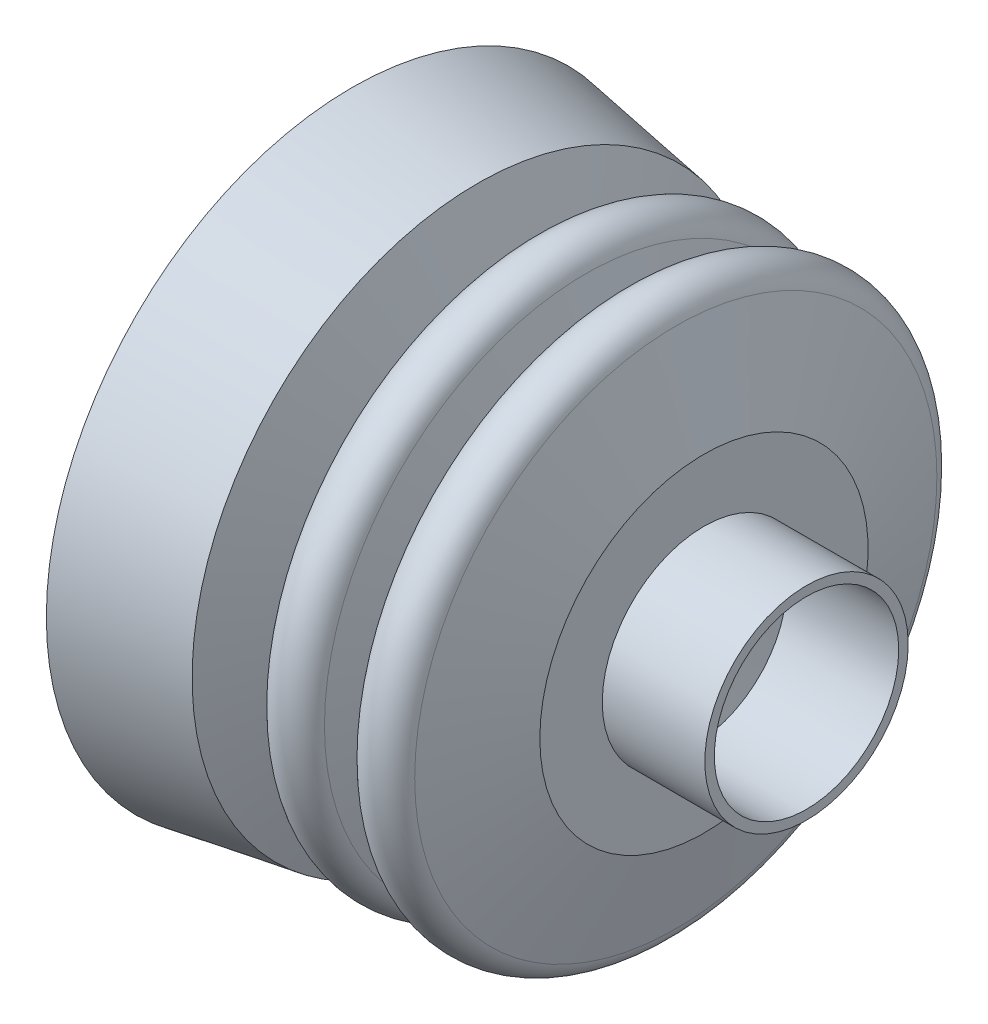
ISO-10303-21;
HEADER;
FILE_DESCRIPTION(('STEP AP214'),'2;1');
FILE_NAME('part.step','',(''),(''),'','','');
FILE_SCHEMA(('AUTOMOTIVE_DESIGN { 1 0 10303 214 1 1 1 1 }'));
ENDSEC;
DATA;
#1=APPLICATION_CONTEXT('core data for automotive mechanical design processes');
#2=APPLICATION_PROTOCOL_DEFINITION('international standard','automotive_design',2000,#1);
#3=PRODUCT_CONTEXT('',#1,'mechanical');
#4=PRODUCT('Part','Part','',(#3));
#5=PRODUCT_RELATED_PRODUCT_CATEGORY('part','',(#4));
#6=PRODUCT_DEFINITION_FORMATION('','',#4);
#7=PRODUCT_DEFINITION_CONTEXT('part definition',#1,'design');
#8=PRODUCT_DEFINITION('design','',#6,#7);
#9=PRODUCT_DEFINITION_SHAPE('','',#8);
#10=(LENGTH_UNIT() NAMED_UNIT(*) SI_UNIT(.MILLI.,.METRE.));
#11=(NAMED_UNIT(*) PLANE_ANGLE_UNIT() SI_UNIT($,.RADIAN.));
#12=(NAMED_UNIT(*) SI_UNIT($,.STERADIAN.) SOLID_ANGLE_UNIT());
#13=UNCERTAINTY_MEASURE_WITH_UNIT(LENGTH_MEASURE(1.E-05),#10,'distance_accuracy_value','');
#14=(GEOMETRIC_REPRESENTATION_CONTEXT(3) GLOBAL_UNCERTAINTY_ASSIGNED_CONTEXT((#13)) GLOBAL_UNIT_ASSIGNED_CONTEXT((#10,
#11,#12)) REPRESENTATION_CONTEXT('',''));
#15=CARTESIAN_POINT('',(0.,0.,0.));
#16=DIRECTION('',(0.,0.,1.));
#17=DIRECTION('',(1.,0.,0.));
#18=AXIS2_PLACEMENT_3D('',#15,#16,#17);
#19=CARTESIAN_POINT('',(24.3215823291821,19.084269403054,0.));
#20=DIRECTION('',(-1.,0.,0.));
#21=DIRECTION('',(0.,0.,1.));
#22=AXIS2_PLACEMENT_3D('',#19,#20,#21);
#23=PLANE('',#22);
#24=CARTESIAN_POINT('',(24.3215823291821,19.084269403054,0.));
#25=DIRECTION('',(1.,0.,0.));
#26=DIRECTION('',(0.,0.,-1.));
#27=AXIS2_PLACEMENT_3D('',#24,#25,#26);
#28=CIRCLE('',#27,4.85271424064872);
#29=CARTESIAN_POINT('',(24.3215823291821,19.084269403054,-4.85271424064872));
#30=VERTEX_POINT('',#29);
#31=EDGE_CURVE('E87',#30,#30,#28,.T.);
#32=ORIENTED_EDGE('',*,*,#31,.F.);
#33=EDGE_LOOP('',(#32));
#34=FACE_BOUND('',#33,.T.);
#35=CARTESIAN_POINT('',(24.3215823291821,19.084269403054,0.));
#36=DIRECTION('',(1.,0.,0.));
#37=DIRECTION('',(0.,0.,-1.));
#38=AXIS2_PLACEMENT_3D('',#35,#36,#37);
#39=CIRCLE('',#38,5.35271424064872);
#40=CARTESIAN_POINT('',(24.3215823291821,19.084269403054,-5.35271424064872));
#41=VERTEX_POINT('',#40);
#42=EDGE_CURVE('E42',#41,#41,#39,.T.);
#43=ORIENTED_EDGE('',*,*,#42,.T.);
#44=EDGE_LOOP('',(#43));
#45=FACE_BOUND('',#44,.T.);
#46=ADVANCED_FACE('F39',(#34,#45),#23,.F.);
#47=CARTESIAN_POINT('',(0.329027714864767,19.084269403054,0.));
#48=DIRECTION('',(1.,0.,0.));
#49=DIRECTION('',(0.,0.,-1.));
#50=AXIS2_PLACEMENT_3D('',#47,#48,#49);
#51=CONICAL_SURFACE('',#50,15.6,1.40916007688253);
#52=CARTESIAN_POINT('',(0.329027714864767,19.084269403054,0.));
#53=DIRECTION('',(1.,0.,0.));
#54=DIRECTION('',(0.,0.,-1.));
#55=AXIS2_PLACEMENT_3D('',#52,#53,#54);
#56=CIRCLE('',#55,15.6);
#57=CARTESIAN_POINT('',(0.329027714864767,19.084269403054,-15.6));
#58=VERTEX_POINT('',#57);
#59=EDGE_CURVE('E10',#58,#58,#56,.T.);
#60=ORIENTED_EDGE('',*,*,#59,.T.);
#61=EDGE_LOOP('',(#60));
#62=FACE_BOUND('',#61,.T.);
#63=CARTESIAN_POINT('',(0.409494386453263,19.084269403054,0.));
#64=DIRECTION('',(-1.,0.,0.));
#65=DIRECTION('',(0.,0.,1.));
#66=AXIS2_PLACEMENT_3D('',#63,#64,#65);
#67=CIRCLE('',#66,16.093482638766);
#68=CARTESIAN_POINT('',(0.409494386453263,19.084269403054,16.093482638766));
#69=VERTEX_POINT('',#68);
#70=EDGE_CURVE('E58',#69,#69,#67,.F.);
#71=ORIENTED_EDGE('',*,*,#70,.F.);
#72=EDGE_LOOP('',(#71));
#73=FACE_BOUND('',#72,.T.);
#74=ADVANCED_FACE('F132',(#62,#73),#51,.T.);
#75=CARTESIAN_POINT('',(0.329027714864767,19.084269403054,0.));
#76=DIRECTION('',(-1.,0.,0.));
#77=DIRECTION('',(0.,0.,1.));
#78=AXIS2_PLACEMENT_3D('',#75,#76,#77);
#79=CONICAL_SURFACE('',#78,15.6,0.16163624991237);
#80=CARTESIAN_POINT('',(6.64004677874887,19.084269403054,0.));
#81=DIRECTION('',(1.,0.,0.));
#82=DIRECTION('',(0.,0.,-1.));
#83=AXIS2_PLACEMENT_3D('',#80,#81,#82);
#84=CIRCLE('',#83,14.5709330004554);
#85=CARTESIAN_POINT('',(6.64004677874887,19.084269403054,-14.5709330004554));
#86=VERTEX_POINT('',#85);
#87=EDGE_CURVE('E46',#86,#86,#84,.T.);
#88=ORIENTED_EDGE('',*,*,#87,.T.);
#89=EDGE_LOOP('',(#88));
#90=FACE_BOUND('',#89,.T.);
#91=ORIENTED_EDGE('',*,*,#59,.F.);
#92=EDGE_LOOP('',(#91));
#93=FACE_BOUND('',#92,.T.);
#94=ADVANCED_FACE('F129',(#90,#93),#79,.F.);
#95=CARTESIAN_POINT('',(6.64004677874887,19.084269403054,0.));
#96=DIRECTION('',(-1.,0.,0.));
#97=DIRECTION('',(0.,0.,1.));
#98=AXIS2_PLACEMENT_3D('',#95,#96,#97);
#99=CONICAL_SURFACE('',#98,14.5709330004554,1.20711734761895);
#100=CARTESIAN_POINT('',(8.92558905356997,19.084269403054,0.));
#101=DIRECTION('',(1.,0.,0.));
#102=DIRECTION('',(0.,0.,-1.));
#103=AXIS2_PLACEMENT_3D('',#100,#101,#102);
#104=CIRCLE('',#103,8.56597036722573);
#105=CARTESIAN_POINT('',(8.92558905356997,19.084269403054,-8.56597036722573));
#106=VERTEX_POINT('',#105);
#107=EDGE_CURVE('E51',#106,#106,#104,.T.);
#108=ORIENTED_EDGE('',*,*,#107,.T.);
#109=EDGE_LOOP('',(#108));
#110=FACE_BOUND('',#109,.T.);
#111=ORIENTED_EDGE('',*,*,#87,.F.);
#112=EDGE_LOOP('',(#111));
#113=FACE_BOUND('',#112,.T.);
#114=ADVANCED_FACE('F114',(#110,#113),#99,.F.);
#115=CARTESIAN_POINT('',(8.92558905356997,19.084269403054,0.));
#116=DIRECTION('',(1.,0.,0.));
#117=DIRECTION('',(0.,0.,-1.));
#118=AXIS2_PLACEMENT_3D('',#115,#116,#117);
#119=CONICAL_SURFACE('',#118,8.56597036722573,1.28805298797182);
#120=CARTESIAN_POINT('',(10.3883796214542,19.084269403054,0.));
#121=DIRECTION('',(1.,0.,0.));
#122=DIRECTION('',(0.,0.,-1.));
#123=AXIS2_PLACEMENT_3D('',#120,#121,#122);
#124=CIRCLE('',#123,13.6009285268223);
#125=CARTESIAN_POINT('',(10.3883796214542,19.084269403054,-13.6009285268223));
#126=VERTEX_POINT('',#125);
#127=EDGE_CURVE('E109',#126,#126,#124,.T.);
#128=ORIENTED_EDGE('',*,*,#127,.T.);
#129=EDGE_LOOP('',(#128));
#130=FACE_BOUND('',#129,.T.);
#131=ORIENTED_EDGE('',*,*,#107,.F.);
#132=EDGE_LOOP('',(#131));
#133=FACE_BOUND('',#132,.T.);
#134=ADVANCED_FACE('F117',(#130,#133),#119,.F.);
#135=CARTESIAN_POINT('',(11.300464400024,19.084269403054,0.));
#136=DIRECTION('',(1.,0.,0.));
#137=DIRECTION('',(0.,0.,-1.));
#138=AXIS2_PLACEMENT_3D('',#135,#136,#137);
#139=TOROIDAL_SURFACE('',#138,13.3359434030314,0.949797746432986);
#140=CARTESIAN_POINT('',(12.2125491785938,19.084269403054,0.));
#141=DIRECTION('',(1.,0.,0.));
#142=DIRECTION('',(0.,0.,-1.));
#143=AXIS2_PLACEMENT_3D('',#140,#141,#142);
#144=CIRCLE('',#143,13.6009285268223);
#145=CARTESIAN_POINT('',(12.2125491785938,19.084269403054,-13.6009285268223));
#146=VERTEX_POINT('',#145);
#147=EDGE_CURVE('E106',#146,#146,#144,.T.);
#148=ORIENTED_EDGE('',*,*,#147,.T.);
#149=EDGE_LOOP('',(#148));
#150=FACE_BOUND('',#149,.T.);
#151=ORIENTED_EDGE('',*,*,#127,.F.);
#152=EDGE_LOOP('',(#151));
#153=FACE_BOUND('',#152,.T.);
#154=ADVANCED_FACE('F119',(#150,#153),#139,.F.);
#155=CARTESIAN_POINT('',(12.2125491785938,19.084269403054,0.));
#156=DIRECTION('',(-1.,0.,0.));
#157=DIRECTION('',(0.,0.,1.));
#158=AXIS2_PLACEMENT_3D('',#155,#156,#157);
#159=CONICAL_SURFACE('',#158,13.6009285268223,1.28805298797182);
#160=CARTESIAN_POINT('',(13.6753397464781,19.084269403054,0.));
#161=DIRECTION('',(1.,0.,0.));
#162=DIRECTION('',(0.,0.,-1.));
#163=AXIS2_PLACEMENT_3D('',#160,#161,#162);
#164=CIRCLE('',#163,8.56597036722573);
#165=CARTESIAN_POINT('',(13.6753397464781,19.084269403054,-8.56597036722573));
#166=VERTEX_POINT('',#165);
#167=EDGE_CURVE('E103',#166,#166,#164,.T.);
#168=ORIENTED_EDGE('',*,*,#167,.T.);
#169=EDGE_LOOP('',(#168));
#170=FACE_BOUND('',#169,.T.);
#171=ORIENTED_EDGE('',*,*,#147,.F.);
#172=EDGE_LOOP('',(#171));
#173=FACE_BOUND('',#172,.T.);
#174=ADVANCED_FACE('F126',(#170,#173),#159,.F.);
#175=CARTESIAN_POINT('',(13.6753397464781,19.084269403054,0.));
#176=DIRECTION('',(1.,0.,0.));
#177=DIRECTION('',(0.,0.,-1.));
#178=AXIS2_PLACEMENT_3D('',#175,#176,#177);
#179=CONICAL_SURFACE('',#178,8.56597036722573,1.28805298797182);
#180=CARTESIAN_POINT('',(15.1381303143624,19.084269403054,0.));
#181=DIRECTION('',(1.,0.,0.));
#182=DIRECTION('',(0.,0.,-1.));
#183=AXIS2_PLACEMENT_3D('',#180,#181,#182);
#184=CIRCLE('',#183,13.6009285268223);
#185=CARTESIAN_POINT('',(15.1381303143624,19.084269403054,-13.6009285268223));
#186=VERTEX_POINT('',#185);
#187=EDGE_CURVE('E100',#186,#186,#184,.T.);
#188=ORIENTED_EDGE('',*,*,#187,.T.);
#189=EDGE_LOOP('',(#188));
#190=FACE_BOUND('',#189,.T.);
#191=ORIENTED_EDGE('',*,*,#167,.F.);
#192=EDGE_LOOP('',(#191));
#193=FACE_BOUND('',#192,.T.);
#194=ADVANCED_FACE('F238',(#190,#193),#179,.F.);
#195=CARTESIAN_POINT('',(16.0502150929322,19.084269403054,0.));
#196=DIRECTION('',(1.,0.,0.));
#197=DIRECTION('',(0.,0.,-1.));
#198=AXIS2_PLACEMENT_3D('',#195,#196,#197);
#199=TOROIDAL_SURFACE('',#198,13.3359434030314,0.949797746432984);
#200=CARTESIAN_POINT('',(16.9622998715019,19.084269403054,0.));
#201=DIRECTION('',(1.,0.,0.));
#202=DIRECTION('',(0.,0.,-1.));
#203=AXIS2_PLACEMENT_3D('',#200,#201,#202);
#204=CIRCLE('',#203,13.6009285268223);
#205=CARTESIAN_POINT('',(16.9622998715019,19.084269403054,-13.6009285268223));
#206=VERTEX_POINT('',#205);
#207=EDGE_CURVE('E97',#206,#206,#204,.T.);
#208=ORIENTED_EDGE('',*,*,#207,.T.);
#209=EDGE_LOOP('',(#208));
#210=FACE_BOUND('',#209,.T.);
#211=ORIENTED_EDGE('',*,*,#187,.F.);
#212=EDGE_LOOP('',(#211));
#213=FACE_BOUND('',#212,.T.);
#214=ADVANCED_FACE('F248',(#210,#213),#199,.F.);
#215=CARTESIAN_POINT('',(16.9622998715019,19.084269403054,0.));
#216=DIRECTION('',(-1.,0.,0.));
#217=DIRECTION('',(0.,0.,1.));
#218=AXIS2_PLACEMENT_3D('',#215,#216,#217);
#219=CONICAL_SURFACE('',#218,13.6009285268223,1.28805298797182);
#220=CARTESIAN_POINT('',(18.4250904393862,19.084269403054,0.));
#221=DIRECTION('',(1.,0.,0.));
#222=DIRECTION('',(0.,0.,-1.));
#223=AXIS2_PLACEMENT_3D('',#220,#221,#222);
#224=CIRCLE('',#223,8.56597036722573);
#225=CARTESIAN_POINT('',(18.4250904393862,19.084269403054,-8.56597036722573));
#226=VERTEX_POINT('',#225);
#227=EDGE_CURVE('E92',#226,#226,#224,.T.);
#228=ORIENTED_EDGE('',*,*,#227,.T.);
#229=EDGE_LOOP('',(#228));
#230=FACE_BOUND('',#229,.T.);
#231=ORIENTED_EDGE('',*,*,#207,.F.);
#232=EDGE_LOOP('',(#231));
#233=FACE_BOUND('',#232,.T.);
#234=ADVANCED_FACE('F258',(#230,#233),#219,.F.);
#235=CARTESIAN_POINT('',(18.4250904393862,27.6502397702797,0.));
#236=DIRECTION('',(-1.,0.,0.));
#237=DIRECTION('',(0.,0.,1.));
#238=AXIS2_PLACEMENT_3D('',#235,#236,#237);
#239=PLANE('',#238);
#240=CARTESIAN_POINT('',(18.4250904393862,19.084269403054,0.));
#241=DIRECTION('',(1.,0.,0.));
#242=DIRECTION('',(0.,0.,-1.));
#243=AXIS2_PLACEMENT_3D('',#240,#241,#242);
#244=CIRCLE('',#243,4.85271424064872);
#245=CARTESIAN_POINT('',(18.4250904393862,19.084269403054,-4.85271424064872));
#246=VERTEX_POINT('',#245);
#247=EDGE_CURVE('E83',#246,#246,#244,.T.);
#248=ORIENTED_EDGE('',*,*,#247,.T.);
#249=EDGE_LOOP('',(#248));
#250=FACE_BOUND('',#249,.T.);
#251=ORIENTED_EDGE('',*,*,#227,.F.);
#252=EDGE_LOOP('',(#251));
#253=FACE_BOUND('',#252,.T.);
#254=ADVANCED_FACE('F203',(#250,#253),#239,.T.);
#255=CARTESIAN_POINT('',(2.17431631875578,19.084269403054,0.));
#256=DIRECTION('',(1.,0.,0.));
#257=DIRECTION('',(0.,0.,-1.));
#258=AXIS2_PLACEMENT_3D('',#255,#256,#257);
#259=CYLINDRICAL_SURFACE('',#258,4.85271424064872);
#260=ORIENTED_EDGE('',*,*,#31,.T.);
#261=EDGE_LOOP('',(#260));
#262=FACE_BOUND('',#261,.T.);
#263=ORIENTED_EDGE('',*,*,#247,.F.);
#264=EDGE_LOOP('',(#263));
#265=FACE_BOUND('',#264,.T.);
#266=ADVANCED_FACE('F198',(#262,#265),#259,.F.);
#267=CARTESIAN_POINT('',(0.409494386453263,19.084269403054,0.));
#268=DIRECTION('',(-1.,0.,0.));
#269=DIRECTION('',(0.,0.,1.));
#270=AXIS2_PLACEMENT_3D('',#267,#268,#269);
#271=CONICAL_SURFACE('',#270,16.093482638766,0.16163624991237);
#272=CARTESIAN_POINT('',(7.00486137086464,19.084269403054,0.));
#273=DIRECTION('',(1.,0.,0.));
#274=DIRECTION('',(0.,0.,-1.));
#275=AXIS2_PLACEMENT_3D('',#272,#273,#274);
#276=CIRCLE('',#275,15.0180502173392);
#277=CARTESIAN_POINT('',(7.00486137086464,19.084269403054,-15.0180502173392));
#278=VERTEX_POINT('',#277);
#279=EDGE_CURVE('E55',#278,#278,#276,.T.);
#280=ORIENTED_EDGE('',*,*,#279,.F.);
#281=EDGE_LOOP('',(#280));
#282=FACE_BOUND('',#281,.T.);
#283=ORIENTED_EDGE('',*,*,#70,.T.);
#284=EDGE_LOOP('',(#283));
#285=FACE_BOUND('',#284,.T.);
#286=ADVANCED_FACE('F193',(#282,#285),#271,.T.);
#287=CARTESIAN_POINT('',(7.10734402045434,19.084269403054,0.));
#288=DIRECTION('',(-1.,0.,0.));
#289=DIRECTION('',(0.,0.,1.));
#290=AXIS2_PLACEMENT_3D('',#287,#288,#289);
#291=CONICAL_SURFACE('',#290,14.7487904936753,1.20711734761895);
#292=CARTESIAN_POINT('',(8.86190027878763,19.084269403054,0.));
#293=DIRECTION('',(1.,0.,0.));
#294=DIRECTION('',(0.,0.,-1.));
#295=AXIS2_PLACEMENT_3D('',#292,#293,#294);
#296=CIRCLE('',#295,10.1389239927306);
#297=CARTESIAN_POINT('',(8.86190027878763,19.084269403054,-10.1389239927306));
#298=VERTEX_POINT('',#297);
#299=EDGE_CURVE('E59',#298,#298,#296,.T.);
#300=ORIENTED_EDGE('',*,*,#299,.F.);
#301=EDGE_LOOP('',(#300));
#302=FACE_BOUND('',#301,.T.);
#303=ORIENTED_EDGE('',*,*,#279,.T.);
#304=EDGE_LOOP('',(#303));
#305=FACE_BOUND('',#304,.T.);
#306=ADVANCED_FACE('F187',(#302,#305),#291,.T.);
#307=CARTESIAN_POINT('',(8.4454422107315,19.084269403054,0.));
#308=DIRECTION('',(1.,0.,0.));
#309=DIRECTION('',(0.,0.,-1.));
#310=AXIS2_PLACEMENT_3D('',#307,#308,#309);
#311=CONICAL_SURFACE('',#310,8.70546592024535,1.28805298797182);
#312=CARTESIAN_POINT('',(9.90823277861577,19.084269403054,0.));
#313=DIRECTION('',(1.,0.,0.));
#314=DIRECTION('',(0.,0.,-1.));
#315=AXIS2_PLACEMENT_3D('',#312,#313,#314);
#316=CIRCLE('',#315,13.7404240798419);
#317=CARTESIAN_POINT('',(9.90823277861577,19.084269403054,-13.7404240798419));
#318=VERTEX_POINT('',#317);
#319=EDGE_CURVE('E62',#318,#318,#316,.T.);
#320=ORIENTED_EDGE('',*,*,#319,.F.);
#321=EDGE_LOOP('',(#320));
#322=FACE_BOUND('',#321,.T.);
#323=ORIENTED_EDGE('',*,*,#299,.T.);
#324=EDGE_LOOP('',(#323));
#325=FACE_BOUND('',#324,.T.);
#326=ADVANCED_FACE('F181',(#322,#325),#311,.T.);
#327=CARTESIAN_POINT('',(11.300464400024,19.084269403054,0.));
#328=DIRECTION('',(1.,0.,0.));
#329=DIRECTION('',(0.,0.,-1.));
#330=AXIS2_PLACEMENT_3D('',#327,#328,#329);
#331=TOROIDAL_SURFACE('',#330,13.3359434030314,1.44979774643299);
#332=CARTESIAN_POINT('',(12.6926960214323,19.084269403054,0.));
#333=DIRECTION('',(1.,0.,0.));
#334=DIRECTION('',(0.,0.,-1.));
#335=AXIS2_PLACEMENT_3D('',#332,#333,#334);
#336=CIRCLE('',#335,13.7404240798419);
#337=CARTESIAN_POINT('',(12.6926960214323,19.084269403054,-13.7404240798419));
#338=VERTEX_POINT('',#337);
#339=EDGE_CURVE('E65',#338,#338,#336,.T.);
#340=ORIENTED_EDGE('',*,*,#339,.F.);
#341=EDGE_LOOP('',(#340));
#342=FACE_BOUND('',#341,.T.);
#343=ORIENTED_EDGE('',*,*,#319,.T.);
#344=EDGE_LOOP('',(#343));
#345=FACE_BOUND('',#344,.T.);
#346=ADVANCED_FACE('F175',(#342,#345),#331,.T.);
#347=CARTESIAN_POINT('',(12.6926960214323,19.084269403054,0.));
#348=DIRECTION('',(-1.,0.,0.));
#349=DIRECTION('',(0.,0.,1.));
#350=AXIS2_PLACEMENT_3D('',#347,#348,#349);
#351=CONICAL_SURFACE('',#350,13.7404240798419,1.28805298797182);
#352=CARTESIAN_POINT('',(13.6753397464781,19.084269403054,0.));
#353=DIRECTION('',(1.,0.,0.));
#354=DIRECTION('',(0.,0.,-1.));
#355=AXIS2_PLACEMENT_3D('',#352,#353,#354);
#356=CIRCLE('',#355,10.3581421934118);
#357=CARTESIAN_POINT('',(13.6753397464781,19.084269403054,-10.3581421934118));
#358=VERTEX_POINT('',#357);
#359=EDGE_CURVE('E68',#358,#358,#356,.T.);
#360=ORIENTED_EDGE('',*,*,#359,.F.);
#361=EDGE_LOOP('',(#360));
#362=FACE_BOUND('',#361,.T.);
#363=ORIENTED_EDGE('',*,*,#339,.T.);
#364=EDGE_LOOP('',(#363));
#365=FACE_BOUND('',#364,.T.);
#366=ADVANCED_FACE('F169',(#362,#365),#351,.T.);
#367=CARTESIAN_POINT('',(13.1951929036396,19.084269403054,0.));
#368=DIRECTION('',(1.,0.,0.));
#369=DIRECTION('',(0.,0.,-1.));
#370=AXIS2_PLACEMENT_3D('',#367,#368,#369);
#371=CONICAL_SURFACE('',#370,8.70546592024535,1.28805298797182);
#372=CARTESIAN_POINT('',(14.6579834715239,19.084269403054,0.));
#373=DIRECTION('',(1.,0.,0.));
#374=DIRECTION('',(0.,0.,-1.));
#375=AXIS2_PLACEMENT_3D('',#372,#373,#374);
#376=CIRCLE('',#375,13.7404240798419);
#377=CARTESIAN_POINT('',(14.6579834715239,19.084269403054,-13.7404240798419));
#378=VERTEX_POINT('',#377);
#379=EDGE_CURVE('E71',#378,#378,#376,.T.);
#380=ORIENTED_EDGE('',*,*,#379,.F.);
#381=EDGE_LOOP('',(#380));
#382=FACE_BOUND('',#381,.T.);
#383=ORIENTED_EDGE('',*,*,#359,.T.);
#384=EDGE_LOOP('',(#383));
#385=FACE_BOUND('',#384,.T.);
#386=ADVANCED_FACE('F163',(#382,#385),#371,.T.);
#387=CARTESIAN_POINT('',(16.0502150929322,19.084269403054,0.));
#388=DIRECTION('',(1.,0.,0.));
#389=DIRECTION('',(0.,0.,-1.));
#390=AXIS2_PLACEMENT_3D('',#387,#388,#389);
#391=TOROIDAL_SURFACE('',#390,13.3359434030314,1.44979774643298);
#392=CARTESIAN_POINT('',(17.4424467143404,19.084269403054,0.));
#393=DIRECTION('',(1.,0.,0.));
#394=DIRECTION('',(0.,0.,-1.));
#395=AXIS2_PLACEMENT_3D('',#392,#393,#394);
#396=CIRCLE('',#395,13.7404240798419);
#397=CARTESIAN_POINT('',(17.4424467143404,19.084269403054,-13.7404240798419));
#398=VERTEX_POINT('',#397);
#399=EDGE_CURVE('E74',#398,#398,#396,.T.);
#400=ORIENTED_EDGE('',*,*,#399,.F.);
#401=EDGE_LOOP('',(#400));
#402=FACE_BOUND('',#401,.T.);
#403=ORIENTED_EDGE('',*,*,#379,.T.);
#404=EDGE_LOOP('',(#403));
#405=FACE_BOUND('',#404,.T.);
#406=ADVANCED_FACE('F157',(#402,#405),#391,.T.);
#407=CARTESIAN_POINT('',(17.4424467143404,19.084269403054,0.));
#408=DIRECTION('',(-1.,0.,0.));
#409=DIRECTION('',(0.,0.,1.));
#410=AXIS2_PLACEMENT_3D('',#407,#408,#409);
#411=CONICAL_SURFACE('',#410,13.7404240798419,1.28805298797182);
#412=CARTESIAN_POINT('',(18.9250904393862,19.084269403054,0.));
#413=DIRECTION('',(-1.,0.,0.));
#414=DIRECTION('',(0.,0.,1.));
#415=AXIS2_PLACEMENT_3D('',#412,#413,#414);
#416=CIRCLE('',#415,8.63713090507721);
#417=CARTESIAN_POINT('',(18.9250904393862,19.084269403054,8.63713090507721));
#418=VERTEX_POINT('',#417);
#419=EDGE_CURVE('E77',#418,#418,#416,.F.);
#420=ORIENTED_EDGE('',*,*,#419,.F.);
#421=EDGE_LOOP('',(#420));
#422=FACE_BOUND('',#421,.T.);
#423=ORIENTED_EDGE('',*,*,#399,.T.);
#424=EDGE_LOOP('',(#423));
#425=FACE_BOUND('',#424,.T.);
#426=ADVANCED_FACE('F151',(#422,#425),#411,.T.);
#427=CARTESIAN_POINT('',(18.9250904393862,27.6502397702797,0.));
#428=DIRECTION('',(-1.,0.,0.));
#429=DIRECTION('',(0.,0.,1.));
#430=AXIS2_PLACEMENT_3D('',#427,#428,#429);
#431=PLANE('',#430);
#432=CARTESIAN_POINT('',(18.9250904393862,19.084269403054,0.));
#433=DIRECTION('',(-1.,0.,0.));
#434=DIRECTION('',(0.,0.,1.));
#435=AXIS2_PLACEMENT_3D('',#432,#433,#434);
#436=CIRCLE('',#435,5.35271424064872);
#437=CARTESIAN_POINT('',(18.9250904393862,19.084269403054,5.35271424064872));
#438=VERTEX_POINT('',#437);
#439=EDGE_CURVE('E80',#438,#438,#436,.F.);
#440=ORIENTED_EDGE('',*,*,#439,.F.);
#441=EDGE_LOOP('',(#440));
#442=FACE_BOUND('',#441,.T.);
#443=ORIENTED_EDGE('',*,*,#419,.T.);
#444=EDGE_LOOP('',(#443));
#445=FACE_BOUND('',#444,.T.);
#446=ADVANCED_FACE('F145',(#442,#445),#431,.F.);
#447=CARTESIAN_POINT('',(2.17431631875578,19.084269403054,0.));
#448=DIRECTION('',(1.,0.,0.));
#449=DIRECTION('',(0.,0.,-1.));
#450=AXIS2_PLACEMENT_3D('',#447,#448,#449);
#451=CYLINDRICAL_SURFACE('',#450,5.35271424064872);
#452=ORIENTED_EDGE('',*,*,#42,.F.);
#453=EDGE_LOOP('',(#452));
#454=FACE_BOUND('',#453,.T.);
#455=ORIENTED_EDGE('',*,*,#439,.T.);
#456=EDGE_LOOP('',(#455));
#457=FACE_BOUND('',#456,.T.);
#458=ADVANCED_FACE('F142',(#454,#457),#451,.T.);
#459=CLOSED_SHELL('',(#46,#74,#94,#114,#134,#154,#174,#194,#214,#234,#254,#266,#286,#306,#326,
#346,#366,#386,#406,#426,#446,#458));
#460=MANIFOLD_SOLID_BREP('B2',#459);
#461=ADVANCED_BREP_SHAPE_REPRESENTATION('',(#18,#460),#14);
#462=SHAPE_DEFINITION_REPRESENTATION(#9,#461);
ENDSEC;
END-ISO-10303-21;
